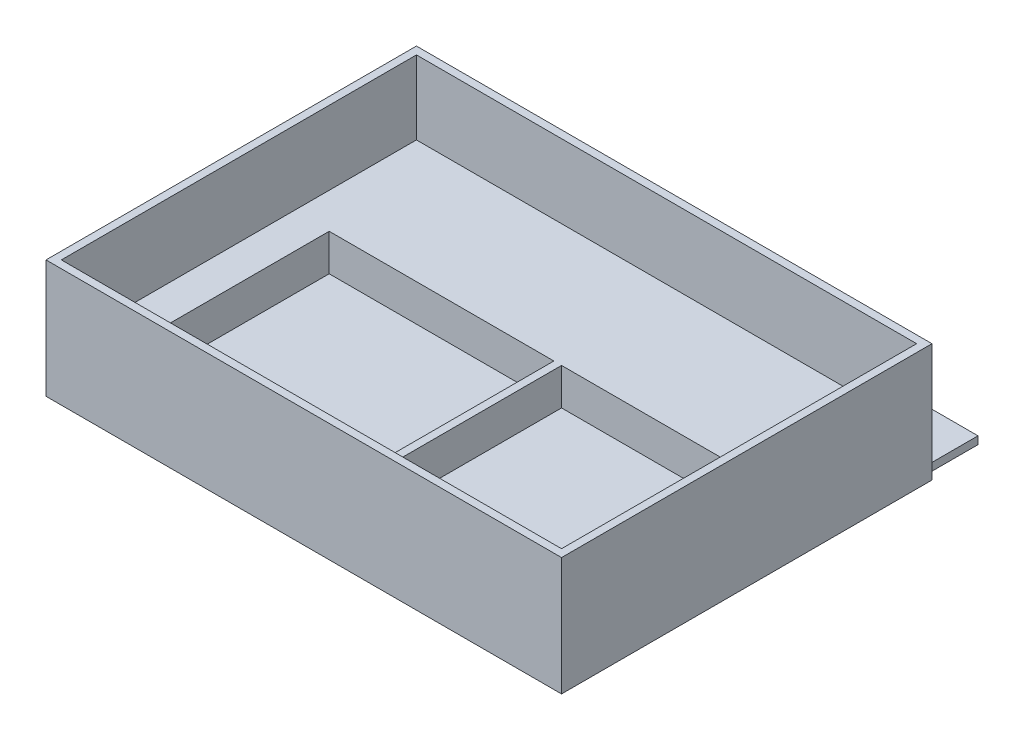
ISO-10303-21;
HEADER;
FILE_DESCRIPTION(('STEP AP214'),'2;1');
FILE_NAME('part.step','',(''),(''),'','','');
FILE_SCHEMA(('AUTOMOTIVE_DESIGN { 1 0 10303 214 1 1 1 1 }'));
ENDSEC;
DATA;
#1=APPLICATION_CONTEXT('core data for automotive mechanical design processes');
#2=APPLICATION_PROTOCOL_DEFINITION('international standard','automotive_design',2000,#1);
#3=PRODUCT_CONTEXT('',#1,'mechanical');
#4=PRODUCT('Part','Part','',(#3));
#5=PRODUCT_RELATED_PRODUCT_CATEGORY('part','',(#4));
#6=PRODUCT_DEFINITION_FORMATION('','',#4);
#7=PRODUCT_DEFINITION_CONTEXT('part definition',#1,'design');
#8=PRODUCT_DEFINITION('design','',#6,#7);
#9=PRODUCT_DEFINITION_SHAPE('','',#8);
#10=(LENGTH_UNIT() NAMED_UNIT(*) SI_UNIT(.MILLI.,.METRE.));
#11=(NAMED_UNIT(*) PLANE_ANGLE_UNIT() SI_UNIT($,.RADIAN.));
#12=(NAMED_UNIT(*) SI_UNIT($,.STERADIAN.) SOLID_ANGLE_UNIT());
#13=UNCERTAINTY_MEASURE_WITH_UNIT(LENGTH_MEASURE(1.E-05),#10,'distance_accuracy_value','');
#14=(GEOMETRIC_REPRESENTATION_CONTEXT(3) GLOBAL_UNCERTAINTY_ASSIGNED_CONTEXT((#13)) GLOBAL_UNIT_ASSIGNED_CONTEXT((#10,
#11,#12)) REPRESENTATION_CONTEXT('',''));
#15=CARTESIAN_POINT('',(0.,0.,0.));
#16=DIRECTION('',(0.,0.,1.));
#17=DIRECTION('',(1.,0.,0.));
#18=AXIS2_PLACEMENT_3D('',#15,#16,#17);
#19=CARTESIAN_POINT('',(0.,45.72,0.));
#20=DIRECTION('',(0.,-1.,0.));
#21=DIRECTION('',(0.,0.,-1.));
#22=AXIS2_PLACEMENT_3D('',#19,#20,#21);
#23=PLANE('',#22);
#24=DIRECTION('',(0.,0.,1.));
#25=VECTOR('',#24,1.);
#26=CARTESIAN_POINT('',(-304.8,45.72,152.4));
#27=LINE('',#26,#25);
#28=CARTESIAN_POINT('',(-304.8,45.72,-130.175));
#29=VERTEX_POINT('',#28);
#30=CARTESIAN_POINT('',(-304.8,45.72,23.15));
#31=VERTEX_POINT('',#30);
#32=EDGE_CURVE('E177',#29,#31,#27,.T.);
#33=ORIENTED_EDGE('',*,*,#32,.T.);
#34=DIRECTION('',(-1.,0.,0.));
#35=VECTOR('',#34,1.);
#36=CARTESIAN_POINT('',(-304.8,45.72,23.15));
#37=LINE('',#36,#35);
#38=CARTESIAN_POINT('',(-91.4125,45.72,23.15));
#39=VERTEX_POINT('',#38);
#40=EDGE_CURVE('E192',#39,#31,#37,.T.);
#41=ORIENTED_EDGE('',*,*,#40,.F.);
#42=DIRECTION('',(0.,0.,1.));
#43=VECTOR('',#42,1.);
#44=CARTESIAN_POINT('',(-91.4125,45.72,130.175));
#45=LINE('',#44,#43);
#46=CARTESIAN_POINT('',(-91.4125,45.72,-130.175));
#47=VERTEX_POINT('',#46);
#48=EDGE_CURVE('E207',#47,#39,#45,.T.);
#49=ORIENTED_EDGE('',*,*,#48,.F.);
#50=DIRECTION('',(-1.,0.,0.));
#51=VECTOR('',#50,1.);
#52=CARTESIAN_POINT('',(-304.8,45.72,-130.175));
#53=LINE('',#52,#51);
#54=EDGE_CURVE('E272',#47,#29,#53,.T.);
#55=ORIENTED_EDGE('',*,*,#54,.T.);
#56=EDGE_LOOP('',(#33,#41,#49,#55));
#57=FACE_BOUND('',#56,.T.);
#58=DIRECTION('',(0.,0.,1.));
#59=VECTOR('',#58,1.);
#60=CARTESIAN_POINT('',(-94.5875,45.72,130.175));
#61=LINE('',#60,#59);
#62=CARTESIAN_POINT('',(-94.5875,45.72,-127.));
#63=VERTEX_POINT('',#62);
#64=CARTESIAN_POINT('',(-94.5875,45.72,19.975));
#65=VERTEX_POINT('',#64);
#66=EDGE_CURVE('E204',#63,#65,#61,.T.);
#67=ORIENTED_EDGE('',*,*,#66,.T.);
#68=DIRECTION('',(-1.,0.,0.));
#69=VECTOR('',#68,1.);
#70=CARTESIAN_POINT('',(-304.8,45.72,19.975));
#71=LINE('',#70,#69);
#72=CARTESIAN_POINT('',(-301.625,45.72,19.975));
#73=VERTEX_POINT('',#72);
#74=EDGE_CURVE('E193',#65,#73,#71,.T.);
#75=ORIENTED_EDGE('',*,*,#74,.T.);
#76=DIRECTION('',(0.,0.,1.));
#77=VECTOR('',#76,1.);
#78=CARTESIAN_POINT('',(-301.625,45.72,127.));
#79=LINE('',#78,#77);
#80=CARTESIAN_POINT('',(-301.625,45.72,-127.));
#81=VERTEX_POINT('',#80);
#82=EDGE_CURVE('E284',#81,#73,#79,.T.);
#83=ORIENTED_EDGE('',*,*,#82,.F.);
#84=DIRECTION('',(-1.,0.,0.));
#85=VECTOR('',#84,1.);
#86=CARTESIAN_POINT('',(-301.625,45.72,-127.));
#87=LINE('',#86,#85);
#88=EDGE_CURVE('E286',#63,#81,#87,.T.);
#89=ORIENTED_EDGE('',*,*,#88,.F.);
#90=EDGE_LOOP('',(#67,#75,#83,#89));
#91=FACE_BOUND('',#90,.T.);
#92=ADVANCED_FACE('F36',(#57,#91),#23,.F.);
#93=CARTESIAN_POINT('',(0.,15.24,0.));
#94=DIRECTION('',(0.,-1.,0.));
#95=DIRECTION('',(0.,0.,-1.));
#96=AXIS2_PLACEMENT_3D('',#93,#94,#95);
#97=PLANE('',#96);
#98=DIRECTION('',(0.,0.,1.));
#99=VECTOR('',#98,1.);
#100=CARTESIAN_POINT('',(-190.7625,15.24,-76.2));
#101=LINE('',#100,#99);
#102=CARTESIAN_POINT('',(-190.7625,15.24,-76.2));
#103=VERTEX_POINT('',#102);
#104=CARTESIAN_POINT('',(-190.7625,15.24,16.8));
#105=VERTEX_POINT('',#104);
#106=EDGE_CURVE('E333',#103,#105,#101,.T.);
#107=ORIENTED_EDGE('',*,*,#106,.F.);
#108=DIRECTION('',(-1.,0.,0.));
#109=VECTOR('',#108,1.);
#110=CARTESIAN_POINT('',(-97.7625,15.24,-76.2));
#111=LINE('',#110,#109);
#112=CARTESIAN_POINT('',(-97.7625,15.24,-76.2));
#113=VERTEX_POINT('',#112);
#114=EDGE_CURVE('E341',#113,#103,#111,.T.);
#115=ORIENTED_EDGE('',*,*,#114,.F.);
#116=DIRECTION('',(0.,0.,-1.));
#117=VECTOR('',#116,1.);
#118=CARTESIAN_POINT('',(-97.7625,15.24,-76.2));
#119=LINE('',#118,#117);
#120=CARTESIAN_POINT('',(-97.7625,15.24,16.8));
#121=VERTEX_POINT('',#120);
#122=EDGE_CURVE('E338',#121,#113,#119,.T.);
#123=ORIENTED_EDGE('',*,*,#122,.F.);
#124=DIRECTION('',(1.,0.,0.));
#125=VECTOR('',#124,1.);
#126=CARTESIAN_POINT('',(-97.7625,15.24,16.8));
#127=LINE('',#126,#125);
#128=EDGE_CURVE('E335',#105,#121,#127,.T.);
#129=ORIENTED_EDGE('',*,*,#128,.F.);
#130=EDGE_LOOP('',(#107,#115,#123,#129));
#131=FACE_BOUND('',#130,.T.);
#132=DIRECTION('',(0.,0.,1.));
#133=VECTOR('',#132,1.);
#134=CARTESIAN_POINT('',(-286.9375,15.24,-76.2));
#135=LINE('',#134,#133);
#136=CARTESIAN_POINT('',(-286.9375,15.24,-76.2));
#137=VERTEX_POINT('',#136);
#138=CARTESIAN_POINT('',(-286.9375,15.24,16.8));
#139=VERTEX_POINT('',#138);
#140=EDGE_CURVE('E298',#137,#139,#135,.T.);
#141=ORIENTED_EDGE('',*,*,#140,.F.);
#142=DIRECTION('',(-1.,0.,0.));
#143=VECTOR('',#142,1.);
#144=CARTESIAN_POINT('',(-286.9375,15.24,-76.2));
#145=LINE('',#144,#143);
#146=CARTESIAN_POINT('',(-193.9375,15.24,-76.2));
#147=VERTEX_POINT('',#146);
#148=EDGE_CURVE('E306',#147,#137,#145,.T.);
#149=ORIENTED_EDGE('',*,*,#148,.F.);
#150=DIRECTION('',(0.,0.,-1.));
#151=VECTOR('',#150,1.);
#152=CARTESIAN_POINT('',(-193.9375,15.24,-76.2));
#153=LINE('',#152,#151);
#154=CARTESIAN_POINT('',(-193.9375,15.24,16.8));
#155=VERTEX_POINT('',#154);
#156=EDGE_CURVE('E303',#155,#147,#153,.T.);
#157=ORIENTED_EDGE('',*,*,#156,.F.);
#158=DIRECTION('',(1.,0.,0.));
#159=VECTOR('',#158,1.);
#160=CARTESIAN_POINT('',(-286.9375,15.24,16.8));
#161=LINE('',#160,#159);
#162=EDGE_CURVE('E300',#139,#155,#161,.T.);
#163=ORIENTED_EDGE('',*,*,#162,.F.);
#164=EDGE_LOOP('',(#141,#149,#157,#163));
#165=FACE_BOUND('',#164,.T.);
#166=DIRECTION('',(-1.,0.,0.));
#167=VECTOR('',#166,1.);
#168=CARTESIAN_POINT('',(-190.7625,15.24,19.975));
#169=LINE('',#168,#167);
#170=CARTESIAN_POINT('',(-94.5875,15.24,19.975));
#171=VERTEX_POINT('',#170);
#172=CARTESIAN_POINT('',(-301.625,15.24,19.975));
#173=VERTEX_POINT('',#172);
#174=EDGE_CURVE('E327',#171,#173,#169,.T.);
#175=ORIENTED_EDGE('',*,*,#174,.F.);
#176=DIRECTION('',(0.,0.,1.));
#177=VECTOR('',#176,1.);
#178=CARTESIAN_POINT('',(-94.5875,15.24,16.8));
#179=LINE('',#178,#177);
#180=CARTESIAN_POINT('',(-94.5875,15.24,-127.));
#181=VERTEX_POINT('',#180);
#182=EDGE_CURVE('E330',#181,#171,#179,.T.);
#183=ORIENTED_EDGE('',*,*,#182,.F.);
#184=DIRECTION('',(-1.,0.,0.));
#185=VECTOR('',#184,1.);
#186=CARTESIAN_POINT('',(-301.625,15.24,-127.));
#187=LINE('',#186,#185);
#188=CARTESIAN_POINT('',(-301.625,15.24,-127.));
#189=VERTEX_POINT('',#188);
#190=EDGE_CURVE('E287',#181,#189,#187,.T.);
#191=ORIENTED_EDGE('',*,*,#190,.T.);
#192=DIRECTION('',(0.,0.,1.));
#193=VECTOR('',#192,1.);
#194=CARTESIAN_POINT('',(-301.625,15.24,127.));
#195=LINE('',#194,#193);
#196=EDGE_CURVE('E281',#189,#173,#195,.T.);
#197=ORIENTED_EDGE('',*,*,#196,.T.);
#198=EDGE_LOOP('',(#175,#183,#191,#197));
#199=FACE_BOUND('',#198,.T.);
#200=ADVANCED_FACE('F377',(#131,#165,#199),#97,.F.);
#201=CARTESIAN_POINT('',(0.,-3.175,0.));
#202=DIRECTION('',(0.,-1.,0.));
#203=DIRECTION('',(0.,0.,-1.));
#204=AXIS2_PLACEMENT_3D('',#201,#202,#203);
#205=PLANE('',#204);
#206=CARTESIAN_POINT('',(-114.300000000001,-3.175,-139.7));
#207=DIRECTION('',(0.,1.,0.));
#208=DIRECTION('',(0.,0.,1.));
#209=AXIS2_PLACEMENT_3D('',#206,#207,#208);
#210=CIRCLE('',#209,3.4925);
#211=CARTESIAN_POINT('',(-114.300000000001,-3.175,-136.2075));
#212=VERTEX_POINT('',#211);
#213=EDGE_CURVE('E255',#212,#212,#210,.T.);
#214=ORIENTED_EDGE('',*,*,#213,.T.);
#215=EDGE_LOOP('',(#214));
#216=FACE_BOUND('',#215,.T.);
#217=CARTESIAN_POINT('',(-139.700000000001,-3.175,-139.7));
#218=DIRECTION('',(0.,1.,0.));
#219=DIRECTION('',(0.,0.,1.));
#220=AXIS2_PLACEMENT_3D('',#217,#218,#219);
#221=CIRCLE('',#220,3.4925);
#222=CARTESIAN_POINT('',(-139.700000000001,-3.175,-136.2075));
#223=VERTEX_POINT('',#222);
#224=EDGE_CURVE('E249',#223,#223,#221,.T.);
#225=ORIENTED_EDGE('',*,*,#224,.T.);
#226=EDGE_LOOP('',(#225));
#227=FACE_BOUND('',#226,.T.);
#228=CARTESIAN_POINT('',(-165.100000000001,-3.175,-139.7));
#229=DIRECTION('',(0.,1.,0.));
#230=DIRECTION('',(0.,0.,1.));
#231=AXIS2_PLACEMENT_3D('',#228,#229,#230);
#232=CIRCLE('',#231,3.4925);
#233=CARTESIAN_POINT('',(-165.100000000001,-3.175,-136.2075));
#234=VERTEX_POINT('',#233);
#235=EDGE_CURVE('E243',#234,#234,#232,.T.);
#236=ORIENTED_EDGE('',*,*,#235,.T.);
#237=EDGE_LOOP('',(#236));
#238=FACE_BOUND('',#237,.T.);
#239=CARTESIAN_POINT('',(-190.500000000001,-3.175,-139.7));
#240=DIRECTION('',(0.,1.,0.));
#241=DIRECTION('',(0.,0.,1.));
#242=AXIS2_PLACEMENT_3D('',#239,#240,#241);
#243=CIRCLE('',#242,3.4925);
#244=CARTESIAN_POINT('',(-190.500000000001,-3.175,-136.2075));
#245=VERTEX_POINT('',#244);
#246=EDGE_CURVE('E237',#245,#245,#243,.T.);
#247=ORIENTED_EDGE('',*,*,#246,.T.);
#248=EDGE_LOOP('',(#247));
#249=FACE_BOUND('',#248,.T.);
#250=CARTESIAN_POINT('',(-215.900000000001,-3.175,-139.7));
#251=DIRECTION('',(0.,1.,0.));
#252=DIRECTION('',(0.,0.,1.));
#253=AXIS2_PLACEMENT_3D('',#250,#251,#252);
#254=CIRCLE('',#253,3.4925);
#255=CARTESIAN_POINT('',(-215.900000000001,-3.175,-136.2075));
#256=VERTEX_POINT('',#255);
#257=EDGE_CURVE('E231',#256,#256,#254,.T.);
#258=ORIENTED_EDGE('',*,*,#257,.T.);
#259=EDGE_LOOP('',(#258));
#260=FACE_BOUND('',#259,.T.);
#261=CARTESIAN_POINT('',(-241.300000000001,-3.175,-139.7));
#262=DIRECTION('',(0.,1.,0.));
#263=DIRECTION('',(0.,0.,1.));
#264=AXIS2_PLACEMENT_3D('',#261,#262,#263);
#265=CIRCLE('',#264,3.4925);
#266=CARTESIAN_POINT('',(-241.300000000001,-3.175,-136.2075));
#267=VERTEX_POINT('',#266);
#268=EDGE_CURVE('E224',#267,#267,#265,.T.);
#269=ORIENTED_EDGE('',*,*,#268,.T.);
#270=EDGE_LOOP('',(#269));
#271=FACE_BOUND('',#270,.T.);
#272=CARTESIAN_POINT('',(-266.700000000001,-3.175,-139.7));
#273=DIRECTION('',(0.,1.,0.));
#274=DIRECTION('',(0.,0.,1.));
#275=AXIS2_PLACEMENT_3D('',#272,#273,#274);
#276=CIRCLE('',#275,3.49250000000003);
#277=CARTESIAN_POINT('',(-266.700000000001,-3.175,-136.2075));
#278=VERTEX_POINT('',#277);
#279=EDGE_CURVE('E267',#278,#278,#276,.T.);
#280=ORIENTED_EDGE('',*,*,#279,.T.);
#281=EDGE_LOOP('',(#280));
#282=FACE_BOUND('',#281,.T.);
#283=CARTESIAN_POINT('',(-292.100000000001,-3.175,-139.7));
#284=DIRECTION('',(0.,1.,0.));
#285=DIRECTION('',(0.,0.,1.));
#286=AXIS2_PLACEMENT_3D('',#283,#284,#285);
#287=CIRCLE('',#286,3.49250000000003);
#288=CARTESIAN_POINT('',(-292.100000000001,-3.175,-136.2075));
#289=VERTEX_POINT('',#288);
#290=EDGE_CURVE('E260',#289,#289,#287,.T.);
#291=ORIENTED_EDGE('',*,*,#290,.T.);
#292=EDGE_LOOP('',(#291));
#293=FACE_BOUND('',#292,.T.);
#294=DIRECTION('',(0.,0.,-1.));
#295=VECTOR('',#294,1.);
#296=CARTESIAN_POINT('',(-91.4125,-3.175,130.175));
#297=LINE('',#296,#295);
#298=CARTESIAN_POINT('',(-91.4125,-3.175,23.15));
#299=VERTEX_POINT('',#298);
#300=CARTESIAN_POINT('',(-91.4125,-3.175,-130.175));
#301=VERTEX_POINT('',#300);
#302=EDGE_CURVE('E183',#299,#301,#297,.T.);
#303=ORIENTED_EDGE('',*,*,#302,.F.);
#304=DIRECTION('',(1.,0.,0.));
#305=VECTOR('',#304,1.);
#306=CARTESIAN_POINT('',(-304.8,-3.175,23.15));
#307=LINE('',#306,#305);
#308=CARTESIAN_POINT('',(-304.8,-3.175,23.15));
#309=VERTEX_POINT('',#308);
#310=EDGE_CURVE('E180',#309,#299,#307,.T.);
#311=ORIENTED_EDGE('',*,*,#310,.F.);
#312=DIRECTION('',(0.,0.,-1.));
#313=VECTOR('',#312,1.);
#314=CARTESIAN_POINT('',(-304.8,-3.175,152.4));
#315=LINE('',#314,#313);
#316=CARTESIAN_POINT('',(-304.8,-3.175,-152.4));
#317=VERTEX_POINT('',#316);
#318=EDGE_CURVE('E165',#309,#317,#315,.T.);
#319=ORIENTED_EDGE('',*,*,#318,.T.);
#320=DIRECTION('',(1.,0.,0.));
#321=VECTOR('',#320,1.);
#322=CARTESIAN_POINT('',(-304.8,-3.175,-152.4));
#323=LINE('',#322,#321);
#324=CARTESIAN_POINT('',(-94.5875,-3.175,-152.4));
#325=VERTEX_POINT('',#324);
#326=EDGE_CURVE('E176',#317,#325,#323,.T.);
#327=ORIENTED_EDGE('',*,*,#326,.T.);
#328=DIRECTION('',(0.,0.,1.));
#329=VECTOR('',#328,1.);
#330=CARTESIAN_POINT('',(-94.5875,-3.175,0.));
#331=LINE('',#330,#329);
#332=CARTESIAN_POINT('',(-94.5875,-3.175,-130.175));
#333=VERTEX_POINT('',#332);
#334=EDGE_CURVE('E217',#325,#333,#331,.T.);
#335=ORIENTED_EDGE('',*,*,#334,.T.);
#336=DIRECTION('',(-1.,0.,0.));
#337=VECTOR('',#336,1.);
#338=CARTESIAN_POINT('',(-91.4125,-3.175,-130.175));
#339=LINE('',#338,#337);
#340=EDGE_CURVE('E209',#301,#333,#339,.T.);
#341=ORIENTED_EDGE('',*,*,#340,.F.);
#342=EDGE_LOOP('',(#303,#311,#319,#327,#335,#341));
#343=FACE_BOUND('',#342,.T.);
#344=ADVANCED_FACE('F181',(#216,#227,#238,#249,#260,#271,#282,#293,#343),#205,.T.);
#345=CARTESIAN_POINT('',(-301.625,45.72,127.));
#346=DIRECTION('',(1.,0.,0.));
#347=DIRECTION('',(0.,0.,-1.));
#348=AXIS2_PLACEMENT_3D('',#345,#346,#347);
#349=PLANE('',#348);
#350=ORIENTED_EDGE('',*,*,#82,.T.);
#351=DIRECTION('',(0.,-1.,0.));
#352=VECTOR('',#351,1.);
#353=CARTESIAN_POINT('',(-301.625,45.72,19.975));
#354=LINE('',#353,#352);
#355=EDGE_CURVE('E199',#73,#173,#354,.T.);
#356=ORIENTED_EDGE('',*,*,#355,.T.);
#357=ORIENTED_EDGE('',*,*,#196,.F.);
#358=DIRECTION('',(0.,-1.,0.));
#359=VECTOR('',#358,1.);
#360=CARTESIAN_POINT('',(-301.625,45.72,-127.));
#361=LINE('',#360,#359);
#362=EDGE_CURVE('E289',#81,#189,#361,.T.);
#363=ORIENTED_EDGE('',*,*,#362,.F.);
#364=EDGE_LOOP('',(#350,#356,#357,#363));
#365=FACE_BOUND('',#364,.T.);
#366=ADVANCED_FACE('F405',(#365),#349,.T.);
#367=CARTESIAN_POINT('',(-304.8,15.24,152.4));
#368=DIRECTION('',(1.,0.,0.));
#369=DIRECTION('',(0.,0.,-1.));
#370=AXIS2_PLACEMENT_3D('',#367,#368,#369);
#371=PLANE('',#370);
#372=ORIENTED_EDGE('',*,*,#318,.F.);
#373=DIRECTION('',(0.,-1.,0.));
#374=VECTOR('',#373,1.);
#375=CARTESIAN_POINT('',(-304.8,-3.175,23.15));
#376=LINE('',#375,#374);
#377=EDGE_CURVE('E170',#31,#309,#376,.T.);
#378=ORIENTED_EDGE('',*,*,#377,.F.);
#379=ORIENTED_EDGE('',*,*,#32,.F.);
#380=DIRECTION('',(0.,1.,0.));
#381=VECTOR('',#380,1.);
#382=CARTESIAN_POINT('',(-304.8,-691.544054737356,-130.175));
#383=LINE('',#382,#381);
#384=CARTESIAN_POINT('',(-304.8,-2.22044604925031E-13,-130.175));
#385=VERTEX_POINT('',#384);
#386=EDGE_CURVE('E263',#385,#29,#383,.T.);
#387=ORIENTED_EDGE('',*,*,#386,.F.);
#388=DIRECTION('',(0.,0.,-1.));
#389=VECTOR('',#388,1.);
#390=CARTESIAN_POINT('',(-304.8,0.,152.4));
#391=LINE('',#390,#389);
#392=CARTESIAN_POINT('',(-304.8,0.,-152.4));
#393=VERTEX_POINT('',#392);
#394=EDGE_CURVE('E279',#385,#393,#391,.T.);
#395=ORIENTED_EDGE('',*,*,#394,.T.);
#396=DIRECTION('',(0.,-1.,0.));
#397=VECTOR('',#396,1.);
#398=CARTESIAN_POINT('',(-304.8,15.24,-152.4));
#399=LINE('',#398,#397);
#400=EDGE_CURVE('E44',#393,#317,#399,.T.);
#401=ORIENTED_EDGE('',*,*,#400,.T.);
#402=EDGE_LOOP('',(#372,#378,#379,#387,#395,#401));
#403=FACE_BOUND('',#402,.T.);
#404=ADVANCED_FACE('F167',(#403),#371,.F.);
#405=CARTESIAN_POINT('',(-91.4125,0.,0.));
#406=DIRECTION('',(1.,0.,0.));
#407=DIRECTION('',(0.,0.,-1.));
#408=AXIS2_PLACEMENT_3D('',#405,#406,#407);
#409=PLANE('',#408);
#410=ORIENTED_EDGE('',*,*,#48,.T.);
#411=DIRECTION('',(0.,1.,0.));
#412=VECTOR('',#411,1.);
#413=CARTESIAN_POINT('',(-91.4125,-3.175,23.15));
#414=LINE('',#413,#412);
#415=EDGE_CURVE('E187',#299,#39,#414,.T.);
#416=ORIENTED_EDGE('',*,*,#415,.F.);
#417=ORIENTED_EDGE('',*,*,#302,.T.);
#418=DIRECTION('',(0.,1.,0.));
#419=VECTOR('',#418,1.);
#420=CARTESIAN_POINT('',(-91.4125,45.72,-130.175));
#421=LINE('',#420,#419);
#422=EDGE_CURVE('E203',#301,#47,#421,.T.);
#423=ORIENTED_EDGE('',*,*,#422,.T.);
#424=EDGE_LOOP('',(#410,#416,#417,#423));
#425=FACE_BOUND('',#424,.T.);
#426=ADVANCED_FACE('F445',(#425),#409,.T.);
#427=CARTESIAN_POINT('',(-94.5875,0.,0.));
#428=DIRECTION('',(1.,0.,0.));
#429=DIRECTION('',(0.,0.,-1.));
#430=AXIS2_PLACEMENT_3D('',#427,#428,#429);
#431=PLANE('',#430);
#432=DIRECTION('',(0.,-1.,0.));
#433=VECTOR('',#432,1.);
#434=CARTESIAN_POINT('',(-94.5875,0.,19.975));
#435=LINE('',#434,#433);
#436=EDGE_CURVE('E13',#65,#171,#435,.T.);
#437=ORIENTED_EDGE('',*,*,#436,.F.);
#438=ORIENTED_EDGE('',*,*,#66,.F.);
#439=DIRECTION('',(0.,1.,0.));
#440=VECTOR('',#439,1.);
#441=CARTESIAN_POINT('',(-94.5875,45.72,-127.));
#442=LINE('',#441,#440);
#443=EDGE_CURVE('E220',#181,#63,#442,.T.);
#444=ORIENTED_EDGE('',*,*,#443,.F.);
#445=ORIENTED_EDGE('',*,*,#182,.T.);
#446=EDGE_LOOP('',(#437,#438,#444,#445));
#447=FACE_BOUND('',#446,.T.);
#448=ADVANCED_FACE('F447',(#447),#431,.F.);
#449=CARTESIAN_POINT('',(-301.625,45.72,-127.));
#450=DIRECTION('',(0.,0.,1.));
#451=DIRECTION('',(1.,0.,0.));
#452=AXIS2_PLACEMENT_3D('',#449,#450,#451);
#453=PLANE('',#452);
#454=ORIENTED_EDGE('',*,*,#190,.F.);
#455=ORIENTED_EDGE('',*,*,#443,.T.);
#456=ORIENTED_EDGE('',*,*,#88,.T.);
#457=ORIENTED_EDGE('',*,*,#362,.T.);
#458=EDGE_LOOP('',(#454,#455,#456,#457));
#459=FACE_BOUND('',#458,.T.);
#460=ADVANCED_FACE('F454',(#459),#453,.T.);
#461=CARTESIAN_POINT('',(-304.8,15.24,-152.4));
#462=DIRECTION('',(0.,0.,1.));
#463=DIRECTION('',(1.,0.,0.));
#464=AXIS2_PLACEMENT_3D('',#461,#462,#463);
#465=PLANE('',#464);
#466=DIRECTION('',(0.,1.,0.));
#467=VECTOR('',#466,1.);
#468=CARTESIAN_POINT('',(-94.5875,15.24,-152.4));
#469=LINE('',#468,#467);
#470=CARTESIAN_POINT('',(-94.5875,0.,-152.4));
#471=VERTEX_POINT('',#470);
#472=EDGE_CURVE('E215',#325,#471,#469,.T.);
#473=ORIENTED_EDGE('',*,*,#472,.F.);
#474=ORIENTED_EDGE('',*,*,#326,.F.);
#475=ORIENTED_EDGE('',*,*,#400,.F.);
#476=DIRECTION('',(1.,0.,0.));
#477=VECTOR('',#476,1.);
#478=CARTESIAN_POINT('',(-304.8,0.,-152.4));
#479=LINE('',#478,#477);
#480=EDGE_CURVE('E276',#393,#471,#479,.T.);
#481=ORIENTED_EDGE('',*,*,#480,.T.);
#482=EDGE_LOOP('',(#473,#474,#475,#481));
#483=FACE_BOUND('',#482,.T.);
#484=ADVANCED_FACE('F38',(#483),#465,.F.);
#485=CARTESIAN_POINT('',(0.,0.,0.));
#486=DIRECTION('',(0.,-1.,0.));
#487=DIRECTION('',(0.,0.,-1.));
#488=AXIS2_PLACEMENT_3D('',#485,#486,#487);
#489=PLANE('',#488);
#490=CARTESIAN_POINT('',(-292.100000000001,0.,-139.7));
#491=DIRECTION('',(0.,1.,0.));
#492=DIRECTION('',(0.,0.,1.));
#493=AXIS2_PLACEMENT_3D('',#490,#491,#492);
#494=CIRCLE('',#493,3.49250000000003);
#495=CARTESIAN_POINT('',(-292.100000000001,0.,-136.2075));
#496=VERTEX_POINT('',#495);
#497=EDGE_CURVE('E264',#496,#496,#494,.T.);
#498=ORIENTED_EDGE('',*,*,#497,.F.);
#499=EDGE_LOOP('',(#498));
#500=FACE_BOUND('',#499,.T.);
#501=CARTESIAN_POINT('',(-266.700000000001,0.,-139.7));
#502=DIRECTION('',(0.,1.,0.));
#503=DIRECTION('',(0.,0.,1.));
#504=AXIS2_PLACEMENT_3D('',#501,#502,#503);
#505=CIRCLE('',#504,3.49250000000003);
#506=CARTESIAN_POINT('',(-266.700000000001,0.,-136.2075));
#507=VERTEX_POINT('',#506);
#508=EDGE_CURVE('E227',#507,#507,#505,.T.);
#509=ORIENTED_EDGE('',*,*,#508,.F.);
#510=EDGE_LOOP('',(#509));
#511=FACE_BOUND('',#510,.T.);
#512=CARTESIAN_POINT('',(-241.300000000001,0.,-139.7));
#513=DIRECTION('',(0.,1.,0.));
#514=DIRECTION('',(0.,0.,1.));
#515=AXIS2_PLACEMENT_3D('',#512,#513,#514);
#516=CIRCLE('',#515,3.4925);
#517=CARTESIAN_POINT('',(-241.300000000001,0.,-136.2075));
#518=VERTEX_POINT('',#517);
#519=EDGE_CURVE('E228',#518,#518,#516,.T.);
#520=ORIENTED_EDGE('',*,*,#519,.F.);
#521=EDGE_LOOP('',(#520));
#522=FACE_BOUND('',#521,.T.);
#523=CARTESIAN_POINT('',(-215.900000000001,0.,-139.7));
#524=DIRECTION('',(0.,1.,0.));
#525=DIRECTION('',(0.,0.,1.));
#526=AXIS2_PLACEMENT_3D('',#523,#524,#525);
#527=CIRCLE('',#526,3.4925);
#528=CARTESIAN_POINT('',(-215.900000000001,0.,-136.2075));
#529=VERTEX_POINT('',#528);
#530=EDGE_CURVE('E234',#529,#529,#527,.T.);
#531=ORIENTED_EDGE('',*,*,#530,.F.);
#532=EDGE_LOOP('',(#531));
#533=FACE_BOUND('',#532,.T.);
#534=CARTESIAN_POINT('',(-190.500000000001,0.,-139.7));
#535=DIRECTION('',(0.,1.,0.));
#536=DIRECTION('',(0.,0.,1.));
#537=AXIS2_PLACEMENT_3D('',#534,#535,#536);
#538=CIRCLE('',#537,3.4925);
#539=CARTESIAN_POINT('',(-190.500000000001,0.,-136.2075));
#540=VERTEX_POINT('',#539);
#541=EDGE_CURVE('E240',#540,#540,#538,.T.);
#542=ORIENTED_EDGE('',*,*,#541,.F.);
#543=EDGE_LOOP('',(#542));
#544=FACE_BOUND('',#543,.T.);
#545=CARTESIAN_POINT('',(-165.100000000001,0.,-139.7));
#546=DIRECTION('',(0.,1.,0.));
#547=DIRECTION('',(0.,0.,1.));
#548=AXIS2_PLACEMENT_3D('',#545,#546,#547);
#549=CIRCLE('',#548,3.4925);
#550=CARTESIAN_POINT('',(-165.100000000001,0.,-136.2075));
#551=VERTEX_POINT('',#550);
#552=EDGE_CURVE('E246',#551,#551,#549,.T.);
#553=ORIENTED_EDGE('',*,*,#552,.F.);
#554=EDGE_LOOP('',(#553));
#555=FACE_BOUND('',#554,.T.);
#556=CARTESIAN_POINT('',(-139.700000000001,0.,-139.7));
#557=DIRECTION('',(0.,1.,0.));
#558=DIRECTION('',(0.,0.,1.));
#559=AXIS2_PLACEMENT_3D('',#556,#557,#558);
#560=CIRCLE('',#559,3.4925);
#561=CARTESIAN_POINT('',(-139.700000000001,0.,-136.2075));
#562=VERTEX_POINT('',#561);
#563=EDGE_CURVE('E252',#562,#562,#560,.T.);
#564=ORIENTED_EDGE('',*,*,#563,.F.);
#565=EDGE_LOOP('',(#564));
#566=FACE_BOUND('',#565,.T.);
#567=CARTESIAN_POINT('',(-114.300000000001,0.,-139.7));
#568=DIRECTION('',(0.,1.,0.));
#569=DIRECTION('',(0.,0.,1.));
#570=AXIS2_PLACEMENT_3D('',#567,#568,#569);
#571=CIRCLE('',#570,3.4925);
#572=CARTESIAN_POINT('',(-114.300000000001,0.,-136.2075));
#573=VERTEX_POINT('',#572);
#574=EDGE_CURVE('E223',#573,#573,#571,.T.);
#575=ORIENTED_EDGE('',*,*,#574,.F.);
#576=EDGE_LOOP('',(#575));
#577=FACE_BOUND('',#576,.T.);
#578=DIRECTION('',(0.,0.,1.));
#579=VECTOR('',#578,1.);
#580=CARTESIAN_POINT('',(-94.5875,0.,0.));
#581=LINE('',#580,#579);
#582=CARTESIAN_POINT('',(-94.5875,0.,-130.175));
#583=VERTEX_POINT('',#582);
#584=EDGE_CURVE('E213',#471,#583,#581,.T.);
#585=ORIENTED_EDGE('',*,*,#584,.F.);
#586=ORIENTED_EDGE('',*,*,#480,.F.);
#587=ORIENTED_EDGE('',*,*,#394,.F.);
#588=DIRECTION('',(-1.,0.,0.));
#589=VECTOR('',#588,1.);
#590=CARTESIAN_POINT('',(-304.8,0.,-130.175));
#591=LINE('',#590,#589);
#592=EDGE_CURVE('E274',#583,#385,#591,.T.);
#593=ORIENTED_EDGE('',*,*,#592,.F.);
#594=EDGE_LOOP('',(#585,#586,#587,#593));
#595=FACE_BOUND('',#594,.T.);
#596=ADVANCED_FACE('F439',(#500,#511,#522,#533,#544,#555,#566,#577,#595),#489,.F.);
#597=CARTESIAN_POINT('',(-304.8,-691.544054737356,-130.175));
#598=DIRECTION('',(0.,0.,-1.));
#599=DIRECTION('',(-1.,0.,0.));
#600=AXIS2_PLACEMENT_3D('',#597,#598,#599);
#601=PLANE('',#600);
#602=ORIENTED_EDGE('',*,*,#54,.F.);
#603=ORIENTED_EDGE('',*,*,#422,.F.);
#604=ORIENTED_EDGE('',*,*,#340,.T.);
#605=DIRECTION('',(0.,1.,0.));
#606=VECTOR('',#605,1.);
#607=CARTESIAN_POINT('',(-94.5875,45.72,-130.175));
#608=LINE('',#607,#606);
#609=EDGE_CURVE('E57',#333,#583,#608,.T.);
#610=ORIENTED_EDGE('',*,*,#609,.T.);
#611=ORIENTED_EDGE('',*,*,#592,.T.);
#612=ORIENTED_EDGE('',*,*,#386,.T.);
#613=EDGE_LOOP('',(#602,#603,#604,#610,#611,#612));
#614=FACE_BOUND('',#613,.T.);
#615=ADVANCED_FACE('F442',(#614),#601,.T.);
#616=CARTESIAN_POINT('',(-190.7625,15.24,-76.2));
#617=DIRECTION('',(1.,0.,0.));
#618=DIRECTION('',(0.,0.,-1.));
#619=AXIS2_PLACEMENT_3D('',#616,#617,#618);
#620=PLANE('',#619);
#621=DIRECTION('',(0.,0.,1.));
#622=VECTOR('',#621,1.);
#623=CARTESIAN_POINT('',(-190.7625,0.,-76.2));
#624=LINE('',#623,#622);
#625=CARTESIAN_POINT('',(-190.7625,0.,-76.2));
#626=VERTEX_POINT('',#625);
#627=CARTESIAN_POINT('',(-190.7625,0.,16.8));
#628=VERTEX_POINT('',#627);
#629=EDGE_CURVE('E332',#626,#628,#624,.T.);
#630=ORIENTED_EDGE('',*,*,#629,.F.);
#631=DIRECTION('',(0.,-1.,0.));
#632=VECTOR('',#631,1.);
#633=CARTESIAN_POINT('',(-190.7625,15.24,-76.2));
#634=LINE('',#633,#632);
#635=EDGE_CURVE('E343',#103,#626,#634,.T.);
#636=ORIENTED_EDGE('',*,*,#635,.F.);
#637=ORIENTED_EDGE('',*,*,#106,.T.);
#638=DIRECTION('',(0.,-1.,0.));
#639=VECTOR('',#638,1.);
#640=CARTESIAN_POINT('',(-190.7625,15.24,16.8));
#641=LINE('',#640,#639);
#642=EDGE_CURVE('E359',#105,#628,#641,.T.);
#643=ORIENTED_EDGE('',*,*,#642,.T.);
#644=EDGE_LOOP('',(#630,#636,#637,#643));
#645=FACE_BOUND('',#644,.T.);
#646=ADVANCED_FACE('F364',(#645),#620,.T.);
#647=CARTESIAN_POINT('',(-97.7625,15.24,16.8));
#648=DIRECTION('',(0.,0.,-1.));
#649=DIRECTION('',(-1.,0.,0.));
#650=AXIS2_PLACEMENT_3D('',#647,#648,#649);
#651=PLANE('',#650);
#652=DIRECTION('',(1.,0.,0.));
#653=VECTOR('',#652,1.);
#654=CARTESIAN_POINT('',(-97.7625,0.,16.8));
#655=LINE('',#654,#653);
#656=CARTESIAN_POINT('',(-97.7625,0.,16.8));
#657=VERTEX_POINT('',#656);
#658=EDGE_CURVE('E346',#628,#657,#655,.T.);
#659=ORIENTED_EDGE('',*,*,#658,.F.);
#660=ORIENTED_EDGE('',*,*,#642,.F.);
#661=ORIENTED_EDGE('',*,*,#128,.T.);
#662=DIRECTION('',(0.,-1.,0.));
#663=VECTOR('',#662,1.);
#664=CARTESIAN_POINT('',(-97.7625,15.24,16.8));
#665=LINE('',#664,#663);
#666=EDGE_CURVE('E357',#121,#657,#665,.T.);
#667=ORIENTED_EDGE('',*,*,#666,.T.);
#668=EDGE_LOOP('',(#659,#660,#661,#667));
#669=FACE_BOUND('',#668,.T.);
#670=ADVANCED_FACE('F381',(#669),#651,.T.);
#671=CARTESIAN_POINT('',(-97.7625,15.24,-76.2));
#672=DIRECTION('',(-1.,0.,0.));
#673=DIRECTION('',(0.,0.,1.));
#674=AXIS2_PLACEMENT_3D('',#671,#672,#673);
#675=PLANE('',#674);
#676=DIRECTION('',(0.,0.,-1.));
#677=VECTOR('',#676,1.);
#678=CARTESIAN_POINT('',(-97.7625,0.,-76.2));
#679=LINE('',#678,#677);
#680=CARTESIAN_POINT('',(-97.7625,0.,-76.2));
#681=VERTEX_POINT('',#680);
#682=EDGE_CURVE('E349',#657,#681,#679,.T.);
#683=ORIENTED_EDGE('',*,*,#682,.F.);
#684=ORIENTED_EDGE('',*,*,#666,.F.);
#685=ORIENTED_EDGE('',*,*,#122,.T.);
#686=DIRECTION('',(0.,-1.,0.));
#687=VECTOR('',#686,1.);
#688=CARTESIAN_POINT('',(-97.7625,15.24,-76.2));
#689=LINE('',#688,#687);
#690=EDGE_CURVE('E355',#113,#681,#689,.T.);
#691=ORIENTED_EDGE('',*,*,#690,.T.);
#692=EDGE_LOOP('',(#683,#684,#685,#691));
#693=FACE_BOUND('',#692,.T.);
#694=ADVANCED_FACE('F383',(#693),#675,.T.);
#695=CARTESIAN_POINT('',(-97.7625,15.24,-76.2));
#696=DIRECTION('',(0.,0.,1.));
#697=DIRECTION('',(1.,0.,0.));
#698=AXIS2_PLACEMENT_3D('',#695,#696,#697);
#699=PLANE('',#698);
#700=DIRECTION('',(-1.,0.,0.));
#701=VECTOR('',#700,1.);
#702=CARTESIAN_POINT('',(-97.7625,0.,-76.2));
#703=LINE('',#702,#701);
#704=EDGE_CURVE('E336',#681,#626,#703,.T.);
#705=ORIENTED_EDGE('',*,*,#704,.F.);
#706=ORIENTED_EDGE('',*,*,#690,.F.);
#707=ORIENTED_EDGE('',*,*,#114,.T.);
#708=ORIENTED_EDGE('',*,*,#635,.T.);
#709=EDGE_LOOP('',(#705,#706,#707,#708));
#710=FACE_BOUND('',#709,.T.);
#711=ADVANCED_FACE('F374',(#710),#699,.T.);
#712=CARTESIAN_POINT('',(-94.5875,15.24,16.8));
#713=DIRECTION('',(1.,0.,0.));
#714=DIRECTION('',(0.,0.,-1.));
#715=AXIS2_PLACEMENT_3D('',#712,#713,#714);
#716=PLANE('',#715);
#717=ORIENTED_EDGE('',*,*,#609,.F.);
#718=ORIENTED_EDGE('',*,*,#334,.F.);
#719=ORIENTED_EDGE('',*,*,#472,.T.);
#720=ORIENTED_EDGE('',*,*,#584,.T.);
#721=EDGE_LOOP('',(#717,#718,#719,#720));
#722=FACE_BOUND('',#721,.T.);
#723=ADVANCED_FACE('F390',(#722),#716,.T.);
#724=CARTESIAN_POINT('',(-286.9375,15.24,-76.2));
#725=DIRECTION('',(1.,0.,0.));
#726=DIRECTION('',(0.,0.,-1.));
#727=AXIS2_PLACEMENT_3D('',#724,#725,#726);
#728=PLANE('',#727);
#729=DIRECTION('',(0.,0.,1.));
#730=VECTOR('',#729,1.);
#731=CARTESIAN_POINT('',(-286.9375,0.,-76.2));
#732=LINE('',#731,#730);
#733=CARTESIAN_POINT('',(-286.9375,0.,-76.2));
#734=VERTEX_POINT('',#733);
#735=CARTESIAN_POINT('',(-286.9375,0.,16.8));
#736=VERTEX_POINT('',#735);
#737=EDGE_CURVE('E297',#734,#736,#732,.T.);
#738=ORIENTED_EDGE('',*,*,#737,.F.);
#739=DIRECTION('',(0.,-1.,0.));
#740=VECTOR('',#739,1.);
#741=CARTESIAN_POINT('',(-286.9375,15.24,-76.2));
#742=LINE('',#741,#740);
#743=EDGE_CURVE('E308',#137,#734,#742,.T.);
#744=ORIENTED_EDGE('',*,*,#743,.F.);
#745=ORIENTED_EDGE('',*,*,#140,.T.);
#746=DIRECTION('',(0.,-1.,0.));
#747=VECTOR('',#746,1.);
#748=CARTESIAN_POINT('',(-286.9375,15.24,16.8));
#749=LINE('',#748,#747);
#750=EDGE_CURVE('E324',#139,#736,#749,.T.);
#751=ORIENTED_EDGE('',*,*,#750,.T.);
#752=EDGE_LOOP('',(#738,#744,#745,#751));
#753=FACE_BOUND('',#752,.T.);
#754=ADVANCED_FACE('F424',(#753),#728,.T.);
#755=CARTESIAN_POINT('',(-286.9375,15.24,16.8));
#756=DIRECTION('',(0.,0.,-1.));
#757=DIRECTION('',(-1.,0.,0.));
#758=AXIS2_PLACEMENT_3D('',#755,#756,#757);
#759=PLANE('',#758);
#760=DIRECTION('',(1.,0.,0.));
#761=VECTOR('',#760,1.);
#762=CARTESIAN_POINT('',(-286.9375,0.,16.8));
#763=LINE('',#762,#761);
#764=CARTESIAN_POINT('',(-193.9375,0.,16.8));
#765=VERTEX_POINT('',#764);
#766=EDGE_CURVE('E311',#736,#765,#763,.T.);
#767=ORIENTED_EDGE('',*,*,#766,.F.);
#768=ORIENTED_EDGE('',*,*,#750,.F.);
#769=ORIENTED_EDGE('',*,*,#162,.T.);
#770=DIRECTION('',(0.,-1.,0.));
#771=VECTOR('',#770,1.);
#772=CARTESIAN_POINT('',(-193.9375,15.24,16.8));
#773=LINE('',#772,#771);
#774=EDGE_CURVE('E322',#155,#765,#773,.T.);
#775=ORIENTED_EDGE('',*,*,#774,.T.);
#776=EDGE_LOOP('',(#767,#768,#769,#775));
#777=FACE_BOUND('',#776,.T.);
#778=ADVANCED_FACE('F420',(#777),#759,.T.);
#779=CARTESIAN_POINT('',(-193.9375,15.24,-76.2));
#780=DIRECTION('',(-1.,0.,0.));
#781=DIRECTION('',(0.,0.,1.));
#782=AXIS2_PLACEMENT_3D('',#779,#780,#781);
#783=PLANE('',#782);
#784=DIRECTION('',(0.,0.,-1.));
#785=VECTOR('',#784,1.);
#786=CARTESIAN_POINT('',(-193.9375,0.,-76.2));
#787=LINE('',#786,#785);
#788=CARTESIAN_POINT('',(-193.9375,0.,-76.2));
#789=VERTEX_POINT('',#788);
#790=EDGE_CURVE('E314',#765,#789,#787,.T.);
#791=ORIENTED_EDGE('',*,*,#790,.F.);
#792=ORIENTED_EDGE('',*,*,#774,.F.);
#793=ORIENTED_EDGE('',*,*,#156,.T.);
#794=DIRECTION('',(0.,-1.,0.));
#795=VECTOR('',#794,1.);
#796=CARTESIAN_POINT('',(-193.9375,15.24,-76.2));
#797=LINE('',#796,#795);
#798=EDGE_CURVE('E320',#147,#789,#797,.T.);
#799=ORIENTED_EDGE('',*,*,#798,.T.);
#800=EDGE_LOOP('',(#791,#792,#793,#799));
#801=FACE_BOUND('',#800,.T.);
#802=ADVANCED_FACE('F416',(#801),#783,.T.);
#803=CARTESIAN_POINT('',(-286.9375,15.24,-76.2));
#804=DIRECTION('',(0.,0.,1.));
#805=DIRECTION('',(1.,0.,0.));
#806=AXIS2_PLACEMENT_3D('',#803,#804,#805);
#807=PLANE('',#806);
#808=DIRECTION('',(-1.,0.,0.));
#809=VECTOR('',#808,1.);
#810=CARTESIAN_POINT('',(-286.9375,0.,-76.2));
#811=LINE('',#810,#809);
#812=EDGE_CURVE('E301',#789,#734,#811,.T.);
#813=ORIENTED_EDGE('',*,*,#812,.F.);
#814=ORIENTED_EDGE('',*,*,#798,.F.);
#815=ORIENTED_EDGE('',*,*,#148,.T.);
#816=ORIENTED_EDGE('',*,*,#743,.T.);
#817=EDGE_LOOP('',(#813,#814,#815,#816));
#818=FACE_BOUND('',#817,.T.);
#819=ADVANCED_FACE('F413',(#818),#807,.T.);
#820=CARTESIAN_POINT('',(0.,0.,0.));
#821=DIRECTION('',(0.,-1.,0.));
#822=DIRECTION('',(0.,0.,-1.));
#823=AXIS2_PLACEMENT_3D('',#820,#821,#822);
#824=PLANE('',#823);
#825=ORIENTED_EDGE('',*,*,#737,.T.);
#826=ORIENTED_EDGE('',*,*,#766,.T.);
#827=ORIENTED_EDGE('',*,*,#790,.T.);
#828=ORIENTED_EDGE('',*,*,#812,.T.);
#829=EDGE_LOOP('',(#825,#826,#827,#828));
#830=FACE_BOUND('',#829,.T.);
#831=ADVANCED_FACE('F412',(#830),#824,.F.);
#832=ORIENTED_EDGE('',*,*,#629,.T.);
#833=ORIENTED_EDGE('',*,*,#658,.T.);
#834=ORIENTED_EDGE('',*,*,#682,.T.);
#835=ORIENTED_EDGE('',*,*,#704,.T.);
#836=EDGE_LOOP('',(#832,#833,#834,#835));
#837=FACE_BOUND('',#836,.T.);
#838=ADVANCED_FACE('F370',(#837),#824,.F.);
#839=CARTESIAN_POINT('',(-292.100000000001,-3.175,-139.7));
#840=DIRECTION('',(0.,1.,0.));
#841=DIRECTION('',(0.,0.,1.));
#842=AXIS2_PLACEMENT_3D('',#839,#840,#841);
#843=CYLINDRICAL_SURFACE('',#842,3.49250000000003);
#844=ORIENTED_EDGE('',*,*,#290,.F.);
#845=EDGE_LOOP('',(#844));
#846=FACE_BOUND('',#845,.T.);
#847=ORIENTED_EDGE('',*,*,#497,.T.);
#848=EDGE_LOOP('',(#847));
#849=FACE_BOUND('',#848,.T.);
#850=ADVANCED_FACE('F411',(#846,#849),#843,.F.);
#851=CARTESIAN_POINT('',(-266.700000000001,-3.175,-139.7));
#852=DIRECTION('',(0.,1.,0.));
#853=DIRECTION('',(0.,0.,1.));
#854=AXIS2_PLACEMENT_3D('',#851,#852,#853);
#855=CYLINDRICAL_SURFACE('',#854,3.49250000000003);
#856=ORIENTED_EDGE('',*,*,#279,.F.);
#857=EDGE_LOOP('',(#856));
#858=FACE_BOUND('',#857,.T.);
#859=ORIENTED_EDGE('',*,*,#508,.T.);
#860=EDGE_LOOP('',(#859));
#861=FACE_BOUND('',#860,.T.);
#862=ADVANCED_FACE('F464',(#858,#861),#855,.F.);
#863=CARTESIAN_POINT('',(-241.300000000001,-3.175,-139.7));
#864=DIRECTION('',(0.,1.,0.));
#865=DIRECTION('',(0.,0.,1.));
#866=AXIS2_PLACEMENT_3D('',#863,#864,#865);
#867=CYLINDRICAL_SURFACE('',#866,3.4925);
#868=ORIENTED_EDGE('',*,*,#268,.F.);
#869=EDGE_LOOP('',(#868));
#870=FACE_BOUND('',#869,.T.);
#871=ORIENTED_EDGE('',*,*,#519,.T.);
#872=EDGE_LOOP('',(#871));
#873=FACE_BOUND('',#872,.T.);
#874=ADVANCED_FACE('F460',(#870,#873),#867,.F.);
#875=CARTESIAN_POINT('',(-215.900000000001,-3.175,-139.7));
#876=DIRECTION('',(0.,1.,0.));
#877=DIRECTION('',(0.,0.,1.));
#878=AXIS2_PLACEMENT_3D('',#875,#876,#877);
#879=CYLINDRICAL_SURFACE('',#878,3.4925);
#880=ORIENTED_EDGE('',*,*,#257,.F.);
#881=EDGE_LOOP('',(#880));
#882=FACE_BOUND('',#881,.T.);
#883=ORIENTED_EDGE('',*,*,#530,.T.);
#884=EDGE_LOOP('',(#883));
#885=FACE_BOUND('',#884,.T.);
#886=ADVANCED_FACE('F463',(#882,#885),#879,.F.);
#887=CARTESIAN_POINT('',(-190.500000000001,-3.175,-139.7));
#888=DIRECTION('',(0.,1.,0.));
#889=DIRECTION('',(0.,0.,1.));
#890=AXIS2_PLACEMENT_3D('',#887,#888,#889);
#891=CYLINDRICAL_SURFACE('',#890,3.4925);
#892=ORIENTED_EDGE('',*,*,#246,.F.);
#893=EDGE_LOOP('',(#892));
#894=FACE_BOUND('',#893,.T.);
#895=ORIENTED_EDGE('',*,*,#541,.T.);
#896=EDGE_LOOP('',(#895));
#897=FACE_BOUND('',#896,.T.);
#898=ADVANCED_FACE('F468',(#894,#897),#891,.F.);
#899=CARTESIAN_POINT('',(-165.100000000001,-3.175,-139.7));
#900=DIRECTION('',(0.,1.,0.));
#901=DIRECTION('',(0.,0.,1.));
#902=AXIS2_PLACEMENT_3D('',#899,#900,#901);
#903=CYLINDRICAL_SURFACE('',#902,3.4925);
#904=ORIENTED_EDGE('',*,*,#235,.F.);
#905=EDGE_LOOP('',(#904));
#906=FACE_BOUND('',#905,.T.);
#907=ORIENTED_EDGE('',*,*,#552,.T.);
#908=EDGE_LOOP('',(#907));
#909=FACE_BOUND('',#908,.T.);
#910=ADVANCED_FACE('F472',(#906,#909),#903,.F.);
#911=CARTESIAN_POINT('',(-139.700000000001,-3.175,-139.7));
#912=DIRECTION('',(0.,1.,0.));
#913=DIRECTION('',(0.,0.,1.));
#914=AXIS2_PLACEMENT_3D('',#911,#912,#913);
#915=CYLINDRICAL_SURFACE('',#914,3.4925);
#916=ORIENTED_EDGE('',*,*,#224,.F.);
#917=EDGE_LOOP('',(#916));
#918=FACE_BOUND('',#917,.T.);
#919=ORIENTED_EDGE('',*,*,#563,.T.);
#920=EDGE_LOOP('',(#919));
#921=FACE_BOUND('',#920,.T.);
#922=ADVANCED_FACE('F476',(#918,#921),#915,.F.);
#923=CARTESIAN_POINT('',(-114.300000000001,-3.175,-139.7));
#924=DIRECTION('',(0.,1.,0.));
#925=DIRECTION('',(0.,0.,1.));
#926=AXIS2_PLACEMENT_3D('',#923,#924,#925);
#927=CYLINDRICAL_SURFACE('',#926,3.4925);
#928=ORIENTED_EDGE('',*,*,#213,.F.);
#929=EDGE_LOOP('',(#928));
#930=FACE_BOUND('',#929,.T.);
#931=ORIENTED_EDGE('',*,*,#574,.T.);
#932=EDGE_LOOP('',(#931));
#933=FACE_BOUND('',#932,.T.);
#934=ADVANCED_FACE('F480',(#930,#933),#927,.F.);
#935=CARTESIAN_POINT('',(0.,0.,19.975));
#936=DIRECTION('',(0.,0.,-1.));
#937=DIRECTION('',(-1.,0.,0.));
#938=AXIS2_PLACEMENT_3D('',#935,#936,#937);
#939=PLANE('',#938);
#940=ORIENTED_EDGE('',*,*,#355,.F.);
#941=ORIENTED_EDGE('',*,*,#74,.F.);
#942=ORIENTED_EDGE('',*,*,#436,.T.);
#943=ORIENTED_EDGE('',*,*,#174,.T.);
#944=EDGE_LOOP('',(#940,#941,#942,#943));
#945=FACE_BOUND('',#944,.T.);
#946=ADVANCED_FACE('F457',(#945),#939,.T.);
#947=CARTESIAN_POINT('',(0.,0.,23.15));
#948=DIRECTION('',(0.,0.,-1.));
#949=DIRECTION('',(-1.,0.,0.));
#950=AXIS2_PLACEMENT_3D('',#947,#948,#949);
#951=PLANE('',#950);
#952=ORIENTED_EDGE('',*,*,#377,.T.);
#953=ORIENTED_EDGE('',*,*,#310,.T.);
#954=ORIENTED_EDGE('',*,*,#415,.T.);
#955=ORIENTED_EDGE('',*,*,#40,.T.);
#956=EDGE_LOOP('',(#952,#953,#954,#955));
#957=FACE_BOUND('',#956,.T.);
#958=ADVANCED_FACE('F190',(#957),#951,.F.);
#959=CLOSED_SHELL('',(#92,#200,#344,#366,#404,#426,#448,#460,#484,#596,#615,#646,#670,#694,#711,
#723,#754,#778,#802,#819,#831,#838,#850,#862,#874,#886,#898,#910,#922,#934,#946,#958));
#960=MANIFOLD_SOLID_BREP('B2',#959);
#961=ADVANCED_BREP_SHAPE_REPRESENTATION('',(#18,#960),#14);
#962=SHAPE_DEFINITION_REPRESENTATION(#9,#961);
ENDSEC;
END-ISO-10303-21;
